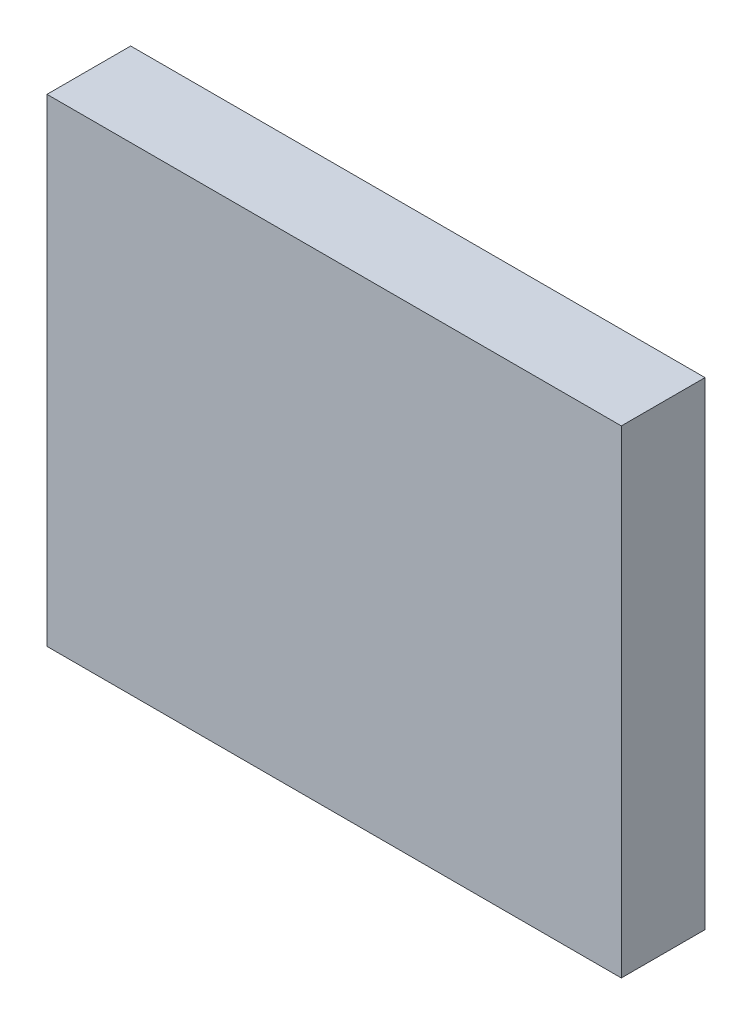
ISO-10303-21;
HEADER;
FILE_DESCRIPTION(('STEP AP214'),'2;1');
FILE_NAME('part.step','',(''),(''),'','','');
FILE_SCHEMA(('AUTOMOTIVE_DESIGN { 1 0 10303 214 1 1 1 1 }'));
ENDSEC;
DATA;
#1=APPLICATION_CONTEXT('core data for automotive mechanical design processes');
#2=APPLICATION_PROTOCOL_DEFINITION('international standard','automotive_design',2000,#1);
#3=PRODUCT_CONTEXT('',#1,'mechanical');
#4=PRODUCT('Part','Part','',(#3));
#5=PRODUCT_RELATED_PRODUCT_CATEGORY('part','',(#4));
#6=PRODUCT_DEFINITION_FORMATION('','',#4);
#7=PRODUCT_DEFINITION_CONTEXT('part definition',#1,'design');
#8=PRODUCT_DEFINITION('design','',#6,#7);
#9=PRODUCT_DEFINITION_SHAPE('','',#8);
#10=(LENGTH_UNIT() NAMED_UNIT(*) SI_UNIT(.MILLI.,.METRE.));
#11=(NAMED_UNIT(*) PLANE_ANGLE_UNIT() SI_UNIT($,.RADIAN.));
#12=(NAMED_UNIT(*) SI_UNIT($,.STERADIAN.) SOLID_ANGLE_UNIT());
#13=UNCERTAINTY_MEASURE_WITH_UNIT(LENGTH_MEASURE(1.E-05),#10,'distance_accuracy_value','');
#14=(GEOMETRIC_REPRESENTATION_CONTEXT(3) GLOBAL_UNCERTAINTY_ASSIGNED_CONTEXT((#13)) GLOBAL_UNIT_ASSIGNED_CONTEXT((#10,
#11,#12)) REPRESENTATION_CONTEXT('',''));
#15=CARTESIAN_POINT('',(0.,0.,0.));
#16=DIRECTION('',(0.,0.,1.));
#17=DIRECTION('',(1.,0.,0.));
#18=AXIS2_PLACEMENT_3D('',#15,#16,#17);
#19=CARTESIAN_POINT('',(-3.4635,-2.963972,1.));
#20=DIRECTION('',(1.,0.,0.));
#21=DIRECTION('',(0.,0.,-1.));
#22=AXIS2_PLACEMENT_3D('',#19,#20,#21);
#23=PLANE('',#22);
#24=DIRECTION('',(0.,-1.,0.));
#25=VECTOR('',#24,1.);
#26=CARTESIAN_POINT('',(-3.4635,-2.963972,0.));
#27=LINE('',#26,#25);
#28=CARTESIAN_POINT('',(-3.4635,2.75,0.));
#29=VERTEX_POINT('',#28);
#30=CARTESIAN_POINT('',(-3.4635,-2.963972,0.));
#31=VERTEX_POINT('',#30);
#32=EDGE_CURVE('E95',#29,#31,#27,.T.);
#33=ORIENTED_EDGE('',*,*,#32,.T.);
#34=DIRECTION('',(0.,0.,-1.));
#35=VECTOR('',#34,1.);
#36=CARTESIAN_POINT('',(-3.4635,-2.963972,1.));
#37=LINE('',#36,#35);
#38=CARTESIAN_POINT('',(-3.4635,-2.963972,1.));
#39=VERTEX_POINT('',#38);
#40=EDGE_CURVE('E11',#39,#31,#37,.T.);
#41=ORIENTED_EDGE('',*,*,#40,.F.);
#42=DIRECTION('',(0.,-1.,0.));
#43=VECTOR('',#42,1.);
#44=CARTESIAN_POINT('',(-3.4635,-2.963972,1.));
#45=LINE('',#44,#43);
#46=CARTESIAN_POINT('',(-3.4635,2.75,1.));
#47=VERTEX_POINT('',#46);
#48=EDGE_CURVE('E83',#47,#39,#45,.T.);
#49=ORIENTED_EDGE('',*,*,#48,.F.);
#50=DIRECTION('',(0.,0.,-1.));
#51=VECTOR('',#50,1.);
#52=CARTESIAN_POINT('',(-3.4635,2.75,1.));
#53=LINE('',#52,#51);
#54=EDGE_CURVE('E91',#47,#29,#53,.T.);
#55=ORIENTED_EDGE('',*,*,#54,.T.);
#56=EDGE_LOOP('',(#33,#41,#49,#55));
#57=FACE_BOUND('',#56,.T.);
#58=ADVANCED_FACE('F32',(#57),#23,.F.);
#59=CARTESIAN_POINT('',(3.4,-2.963972,1.));
#60=DIRECTION('',(0.,1.,0.));
#61=DIRECTION('',(0.,0.,1.));
#62=AXIS2_PLACEMENT_3D('',#59,#60,#61);
#63=PLANE('',#62);
#64=DIRECTION('',(1.,0.,0.));
#65=VECTOR('',#64,1.);
#66=CARTESIAN_POINT('',(3.4,-2.963972,0.));
#67=LINE('',#66,#65);
#68=CARTESIAN_POINT('',(3.4,-2.963972,0.));
#69=VERTEX_POINT('',#68);
#70=EDGE_CURVE('E87',#31,#69,#67,.T.);
#71=ORIENTED_EDGE('',*,*,#70,.T.);
#72=DIRECTION('',(0.,0.,-1.));
#73=VECTOR('',#72,1.);
#74=CARTESIAN_POINT('',(3.4,-2.963972,1.));
#75=LINE('',#74,#73);
#76=CARTESIAN_POINT('',(3.4,-2.963972,1.));
#77=VERTEX_POINT('',#76);
#78=EDGE_CURVE('E40',#77,#69,#75,.T.);
#79=ORIENTED_EDGE('',*,*,#78,.F.);
#80=DIRECTION('',(1.,0.,0.));
#81=VECTOR('',#80,1.);
#82=CARTESIAN_POINT('',(3.4,-2.963972,1.));
#83=LINE('',#82,#81);
#84=EDGE_CURVE('E78',#39,#77,#83,.T.);
#85=ORIENTED_EDGE('',*,*,#84,.F.);
#86=ORIENTED_EDGE('',*,*,#40,.T.);
#87=EDGE_LOOP('',(#71,#79,#85,#86));
#88=FACE_BOUND('',#87,.T.);
#89=ADVANCED_FACE('F86',(#88),#63,.F.);
#90=CARTESIAN_POINT('',(3.4,2.75,1.));
#91=DIRECTION('',(-1.,0.,0.));
#92=DIRECTION('',(0.,0.,1.));
#93=AXIS2_PLACEMENT_3D('',#90,#91,#92);
#94=PLANE('',#93);
#95=DIRECTION('',(0.,1.,0.));
#96=VECTOR('',#95,1.);
#97=CARTESIAN_POINT('',(3.4,2.75,0.));
#98=LINE('',#97,#96);
#99=CARTESIAN_POINT('',(3.4,2.75,0.));
#100=VERTEX_POINT('',#99);
#101=EDGE_CURVE('E65',#69,#100,#98,.T.);
#102=ORIENTED_EDGE('',*,*,#101,.T.);
#103=DIRECTION('',(0.,0.,-1.));
#104=VECTOR('',#103,1.);
#105=CARTESIAN_POINT('',(3.4,2.75,1.));
#106=LINE('',#105,#104);
#107=CARTESIAN_POINT('',(3.4,2.75,1.));
#108=VERTEX_POINT('',#107);
#109=EDGE_CURVE('E88',#108,#100,#106,.T.);
#110=ORIENTED_EDGE('',*,*,#109,.F.);
#111=DIRECTION('',(0.,1.,0.));
#112=VECTOR('',#111,1.);
#113=CARTESIAN_POINT('',(3.4,2.75,1.));
#114=LINE('',#113,#112);
#115=EDGE_CURVE('E81',#77,#108,#114,.T.);
#116=ORIENTED_EDGE('',*,*,#115,.F.);
#117=ORIENTED_EDGE('',*,*,#78,.T.);
#118=EDGE_LOOP('',(#102,#110,#116,#117));
#119=FACE_BOUND('',#118,.T.);
#120=ADVANCED_FACE('F89',(#119),#94,.F.);
#121=CARTESIAN_POINT('',(-3.4635,2.75,1.));
#122=DIRECTION('',(0.,-1.,0.));
#123=DIRECTION('',(0.,0.,-1.));
#124=AXIS2_PLACEMENT_3D('',#121,#122,#123);
#125=PLANE('',#124);
#126=DIRECTION('',(-1.,0.,0.));
#127=VECTOR('',#126,1.);
#128=CARTESIAN_POINT('',(-3.4635,2.75,0.));
#129=LINE('',#128,#127);
#130=EDGE_CURVE('E71',#100,#29,#129,.T.);
#131=ORIENTED_EDGE('',*,*,#130,.T.);
#132=ORIENTED_EDGE('',*,*,#54,.F.);
#133=DIRECTION('',(-1.,0.,0.));
#134=VECTOR('',#133,1.);
#135=CARTESIAN_POINT('',(-3.4635,2.75,1.));
#136=LINE('',#135,#134);
#137=EDGE_CURVE('E48',#108,#47,#136,.T.);
#138=ORIENTED_EDGE('',*,*,#137,.F.);
#139=ORIENTED_EDGE('',*,*,#109,.T.);
#140=EDGE_LOOP('',(#131,#132,#138,#139));
#141=FACE_BOUND('',#140,.T.);
#142=ADVANCED_FACE('F102',(#141),#125,.F.);
#143=CARTESIAN_POINT('',(0.,0.,1.));
#144=DIRECTION('',(0.,0.,-1.));
#145=DIRECTION('',(-1.,0.,0.));
#146=AXIS2_PLACEMENT_3D('',#143,#144,#145);
#147=PLANE('',#146);
#148=ORIENTED_EDGE('',*,*,#48,.T.);
#149=ORIENTED_EDGE('',*,*,#84,.T.);
#150=ORIENTED_EDGE('',*,*,#115,.T.);
#151=ORIENTED_EDGE('',*,*,#137,.T.);
#152=EDGE_LOOP('',(#148,#149,#150,#151));
#153=FACE_BOUND('',#152,.T.);
#154=ADVANCED_FACE('F79',(#153),#147,.F.);
#155=CARTESIAN_POINT('',(0.,0.,0.));
#156=DIRECTION('',(0.,0.,-1.));
#157=DIRECTION('',(-1.,0.,0.));
#158=AXIS2_PLACEMENT_3D('',#155,#156,#157);
#159=PLANE('',#158);
#160=ORIENTED_EDGE('',*,*,#32,.F.);
#161=ORIENTED_EDGE('',*,*,#130,.F.);
#162=ORIENTED_EDGE('',*,*,#101,.F.);
#163=ORIENTED_EDGE('',*,*,#70,.F.);
#164=EDGE_LOOP('',(#160,#161,#162,#163));
#165=FACE_BOUND('',#164,.T.);
#166=ADVANCED_FACE('F105',(#165),#159,.T.);
#167=CLOSED_SHELL('',(#58,#89,#120,#142,#154,#166));
#168=MANIFOLD_SOLID_BREP('B2',#167);
#169=ADVANCED_BREP_SHAPE_REPRESENTATION('',(#18,#168),#14);
#170=SHAPE_DEFINITION_REPRESENTATION(#9,#169);
ENDSEC;
END-ISO-10303-21;
